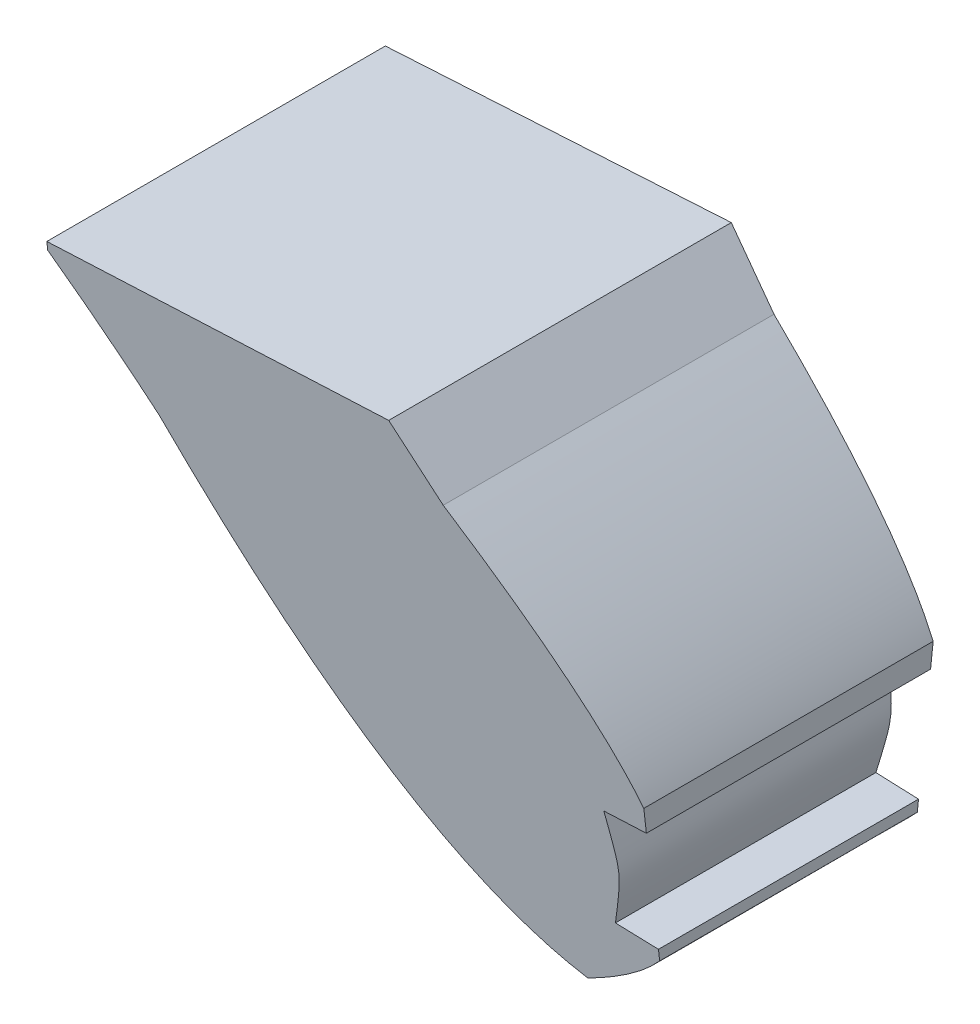
ISO-10303-21;
HEADER;
FILE_DESCRIPTION(('STEP AP214'),'2;1');
FILE_NAME('part.step','',(''),(''),'','','');
FILE_SCHEMA(('AUTOMOTIVE_DESIGN { 1 0 10303 214 1 1 1 1 }'));
ENDSEC;
DATA;
#1=APPLICATION_CONTEXT('core data for automotive mechanical design processes');
#2=APPLICATION_PROTOCOL_DEFINITION('international standard','automotive_design',2000,#1);
#3=PRODUCT_CONTEXT('',#1,'mechanical');
#4=PRODUCT('Part','Part','',(#3));
#5=PRODUCT_RELATED_PRODUCT_CATEGORY('part','',(#4));
#6=PRODUCT_DEFINITION_FORMATION('','',#4);
#7=PRODUCT_DEFINITION_CONTEXT('part definition',#1,'design');
#8=PRODUCT_DEFINITION('design','',#6,#7);
#9=PRODUCT_DEFINITION_SHAPE('','',#8);
#10=(LENGTH_UNIT() NAMED_UNIT(*) SI_UNIT(.MILLI.,.METRE.));
#11=(NAMED_UNIT(*) PLANE_ANGLE_UNIT() SI_UNIT($,.RADIAN.));
#12=(NAMED_UNIT(*) SI_UNIT($,.STERADIAN.) SOLID_ANGLE_UNIT());
#13=UNCERTAINTY_MEASURE_WITH_UNIT(LENGTH_MEASURE(1.E-05),#10,'distance_accuracy_value','');
#14=(GEOMETRIC_REPRESENTATION_CONTEXT(3) GLOBAL_UNCERTAINTY_ASSIGNED_CONTEXT((#13)) GLOBAL_UNIT_ASSIGNED_CONTEXT((#10,
#11,#12)) REPRESENTATION_CONTEXT('',''));
#15=CARTESIAN_POINT('',(0.,0.,0.));
#16=DIRECTION('',(0.,0.,1.));
#17=DIRECTION('',(1.,0.,0.));
#18=AXIS2_PLACEMENT_3D('',#15,#16,#17);
#19=CARTESIAN_POINT('',(0.355125000055651,-1.23774703808888E-13,7.));
#20=DIRECTION('',(-1.,3.48538412642003E-13,0.));
#21=DIRECTION('',(-3.48538412642003E-13,-1.,0.));
#22=AXIS2_PLACEMENT_3D('',#19,#20,#21);
#23=PLANE('',#22);
#24=DIRECTION('',(0.,-0.993653373689782,0.112485434412263));
#25=VECTOR('',#24,1.);
#26=CARTESIAN_POINT('',(0.355125000056697,12.6081551722012,-7.));
#27=LINE('',#26,#25);
#28=CARTESIAN_POINT('',(0.355125000056697,3.0015495286345,-5.91249480185305));
#29=VERTEX_POINT('',#28);
#30=CARTESIAN_POINT('',(0.355125000056447,2.06798317893031,-5.8068114527298));
#31=VERTEX_POINT('',#30);
#32=EDGE_CURVE('E58',#29,#31,#27,.T.);
#33=ORIENTED_EDGE('',*,*,#32,.F.);
#34=DIRECTION('',(0.,0.,-1.));
#35=VECTOR('',#34,1.);
#36=CARTESIAN_POINT('',(0.355125000056697,3.0015495286345,7.));
#37=LINE('',#36,#35);
#38=CARTESIAN_POINT('',(0.355125000056697,3.0015495286345,5.91249480185305));
#39=VERTEX_POINT('',#38);
#40=EDGE_CURVE('E178',#39,#29,#37,.T.);
#41=ORIENTED_EDGE('',*,*,#40,.F.);
#42=DIRECTION('',(0.,0.993653373689782,0.112485434412263));
#43=VECTOR('',#42,1.);
#44=CARTESIAN_POINT('',(0.355125000056697,12.6081551722012,7.));
#45=LINE('',#44,#43);
#46=CARTESIAN_POINT('',(0.355125000056697,2.06798317893032,5.80681145272981));
#47=VERTEX_POINT('',#46);
#48=EDGE_CURVE('E153',#47,#39,#45,.T.);
#49=ORIENTED_EDGE('',*,*,#48,.F.);
#50=DIRECTION('',(0.,0.,-1.));
#51=VECTOR('',#50,1.);
#52=CARTESIAN_POINT('',(0.355125000056447,2.06798317893031,7.));
#53=LINE('',#52,#51);
#54=EDGE_CURVE('E171',#47,#31,#53,.T.);
#55=ORIENTED_EDGE('',*,*,#54,.T.);
#56=EDGE_LOOP('',(#33,#41,#49,#55));
#57=FACE_BOUND('',#56,.T.);
#58=ADVANCED_FACE('F43',(#57),#23,.F.);
#59=CARTESIAN_POINT('',(-23.0359211456035,0.,7.));
#60=DIRECTION('',(-1.,0.,0.));
#61=DIRECTION('',(0.,0.,1.));
#62=AXIS2_PLACEMENT_3D('',#59,#60,#61);
#63=PLANE('',#62);
#64=DIRECTION('',(0.,0.,-1.));
#65=VECTOR('',#64,1.);
#66=CARTESIAN_POINT('',(-23.0359211456035,11.8716122879342,7.));
#67=LINE('',#66,#65);
#68=CARTESIAN_POINT('',(-23.0359211456035,11.8716122879342,6.91662047501294));
#69=VERTEX_POINT('',#68);
#70=CARTESIAN_POINT('',(-23.0359211456035,11.8716122879342,-6.91662047501294));
#71=VERTEX_POINT('',#70);
#72=EDGE_CURVE('E189',#69,#71,#67,.T.);
#73=ORIENTED_EDGE('',*,*,#72,.T.);
#74=DIRECTION('',(0.,-0.993653373689782,0.112485434412263));
#75=VECTOR('',#74,1.);
#76=CARTESIAN_POINT('',(-23.0359211456035,12.6081551722012,-7.));
#77=LINE('',#76,#75);
#78=CARTESIAN_POINT('',(-23.0359211456035,11.5401378200983,-6.87909627341673));
#79=VERTEX_POINT('',#78);
#80=EDGE_CURVE('E321',#71,#79,#77,.T.);
#81=ORIENTED_EDGE('',*,*,#80,.T.);
#82=DIRECTION('',(0.,0.,-1.));
#83=VECTOR('',#82,1.);
#84=CARTESIAN_POINT('',(-23.0359211456035,11.5401378200983,7.));
#85=LINE('',#84,#83);
#86=CARTESIAN_POINT('',(-23.0359211456035,11.5401378200983,6.87909627341673));
#87=VERTEX_POINT('',#86);
#88=EDGE_CURVE('E192',#87,#79,#85,.T.);
#89=ORIENTED_EDGE('',*,*,#88,.F.);
#90=DIRECTION('',(0.,0.993653373689782,0.112485434412263));
#91=VECTOR('',#90,1.);
#92=CARTESIAN_POINT('',(-23.0359211456035,12.6081551722012,7.));
#93=LINE('',#92,#91);
#94=EDGE_CURVE('E317',#87,#69,#93,.T.);
#95=ORIENTED_EDGE('',*,*,#94,.T.);
#96=EDGE_LOOP('',(#73,#81,#89,#95));
#97=FACE_BOUND('',#96,.T.);
#98=ADVANCED_FACE('F318',(#97),#63,.T.);
#99=CARTESIAN_POINT('',(-18.9451921135982,7.54091889574655,7.));
#100=CARTESIAN_POINT('',(-10.2150083842792,-3.69764410322756,7.));
#101=CARTESIAN_POINT('',(-2.84660482498738,-5.05908110388432,7.));
#102=(BOUNDED_CURVE() B_SPLINE_CURVE(2,(#99,#100,#101),.UNSPECIFIED.,.F.,
.F.) B_SPLINE_CURVE_WITH_KNOTS((3,3),(0.497667241108509,0.499554279588011),
.UNSPECIFIED.) CURVE() GEOMETRIC_REPRESENTATION_ITEM() RATIONAL_B_SPLINE_CURVE((1.,1.,1.)) REPRESENTATION_ITEM(''));
#103=DIRECTION('',(0.,0.,-1.));
#104=VECTOR('',#103,1.);
#105=SURFACE_OF_LINEAR_EXTRUSION('',#102,#104);
#106=DIRECTION('',(0.,0.,-1.));
#107=VECTOR('',#106,1.);
#108=CARTESIAN_POINT('',(-18.9451921135982,7.54091889574657,7.));
#109=LINE('',#108,#107);
#110=CARTESIAN_POINT('',(-18.9451921135982,7.54091889574657,6.42636910524442));
#111=VERTEX_POINT('',#110);
#112=CARTESIAN_POINT('',(-18.9451921135982,7.54091889574657,-6.42636910524441));
#113=VERTEX_POINT('',#112);
#114=EDGE_CURVE('E198',#111,#113,#109,.T.);
#115=ORIENTED_EDGE('',*,*,#114,.T.);
#116=CARTESIAN_POINT('',(-18.9451921135982,7.54091889574655,-6.42636910524441));
#117=CARTESIAN_POINT('',(-18.7033608655423,7.22962108931645,-6.39112898035273));
#118=CARTESIAN_POINT('',(-18.4592647140916,6.9200497206851,-6.35608429494821));
#119=CARTESIAN_POINT('',(-17.9661198805234,6.30464603742845,-6.28641819962467));
#120=CARTESIAN_POINT('',(-17.7170694462669,5.99881510969872,-6.25179694670763));
#121=CARTESIAN_POINT('',(-17.2137366178937,5.3913665824337,-6.18303140604553));
#122=CARTESIAN_POINT('',(-16.9594535947769,5.08974949683998,-6.14888717648066));
#123=CARTESIAN_POINT('',(-16.4451285665965,4.49103725761873,-6.08111061767257));
#124=CARTESIAN_POINT('',(-16.1850826962375,4.19394537928884,-6.04747865920581));
#125=CARTESIAN_POINT('',(-15.6590118901181,3.60508061675355,-5.9808168731366));
#126=CARTESIAN_POINT('',(-15.3929875534481,3.31330720485499,-5.94778698579723));
#127=CARTESIAN_POINT('',(-14.8544901847056,2.7357195544677,-5.88240181277285));
#128=CARTESIAN_POINT('',(-14.5820174931064,2.44990500284308,-5.85004649163963));
#129=CARTESIAN_POINT('',(-13.9777704357619,1.83142011947111,-5.78003159245484));
#130=CARTESIAN_POINT('',(-13.6445482479649,1.50014167377654,-5.74252958132897));
#131=CARTESIAN_POINT('',(-12.9673134934436,0.848664446736887,-5.66877982026175));
#132=CARTESIAN_POINT('',(-12.623301443116,0.528465136688492,-5.63253201046914));
#133=CARTESIAN_POINT('',(-11.9227759490938,-0.0995013958587513,-5.5614437516454));
#134=CARTESIAN_POINT('',(-11.5662405708663,-0.407244542107335,-5.52660602813964));
#135=CARTESIAN_POINT('',(-10.840142749037,-1.00720368374379,-5.45868831511867));
#136=CARTESIAN_POINT('',(-10.4705807273197,-1.29942018121482,-5.4256082687657));
#137=CARTESIAN_POINT('',(-9.71382699072171,-1.86779135556405,-5.36126643674768));
#138=CARTESIAN_POINT('',(-9.32650636654571,-2.14377746328672,-5.330023733768));
#139=CARTESIAN_POINT('',(-8.5360986768139,-2.67282289543975,-5.27013372902864));
#140=CARTESIAN_POINT('',(-8.13300835344273,-2.92587744631612,-5.24148696765387));
#141=CARTESIAN_POINT('',(-7.31201826568453,-3.40280761684766,-5.18749661363601));
#142=CARTESIAN_POINT('',(-6.89419365451789,-3.62680992502778,-5.16213867935817));
#143=CARTESIAN_POINT('',(-6.04187322097519,-4.0405536088069,-5.11530128189388));
#144=CARTESIAN_POINT('',(-5.60738935372736,-4.23031901573022,-5.09381909826786));
#145=CARTESIAN_POINT('',(-4.78985442909107,-4.54236533838515,-5.05849423842238));
#146=CARTESIAN_POINT('',(-4.4091055725695,-4.67052923075731,-5.04398558631979));
#147=CARTESIAN_POINT('',(-3.82960691198316,-4.83674345690554,-5.02516948814227));
#148=CARTESIAN_POINT('',(-3.63462104960687,-4.8878904691115,-5.01937944702812));
#149=CARTESIAN_POINT('',(-3.24229120544362,-4.9807402777546,-5.00886848683127));
#150=CARTESIAN_POINT('',(-3.0449461414238,-5.02243854990591,-5.00414807991536));
#151=CARTESIAN_POINT('',(-2.84660482498738,-5.05908110388432,-5.));
#152=B_SPLINE_CURVE_WITH_KNOTS('',3,(#116,#117,#118,#119,#120,#121,#122,#123,#124,#125,#126,
#127,#128,#129,#130,#131,#132,#133,#134,#135,#136,#137,#138,#139,#140,#141,#142,#143,#144,#145,
#146,#147,#148,#149,#150,#151),.UNSPECIFIED.,.F.,.F.,(4,2,2,2,2,2,2,2,2,2,2,2,2,2,2,2,2,4),(0.,
1.1872997216569,2.37502708567824,3.56289806807204,4.75159146291787,5.94016626761519,
7.12867845491362,8.54255640265696,9.95636678593971,11.3727907462706,12.7891688759803,
14.2183172044781,15.6477623519031,17.0707480146133,18.4927309460623,19.6971402338765,
20.3019233237111,20.9069953892921),.UNSPECIFIED.);
#153=CARTESIAN_POINT('',(-2.84660482498738,-5.05908110388432,-5.));
#154=VERTEX_POINT('',#153);
#155=EDGE_CURVE('E258',#113,#154,#152,.T.);
#156=ORIENTED_EDGE('',*,*,#155,.T.);
#157=DIRECTION('',(0.,0.,-1.));
#158=VECTOR('',#157,1.);
#159=CARTESIAN_POINT('',(-2.84660482498738,-5.05908110388432,7.));
#160=LINE('',#159,#158);
#161=CARTESIAN_POINT('',(-2.84660482498738,-5.05908110388432,5.));
#162=VERTEX_POINT('',#161);
#163=EDGE_CURVE('E158',#162,#154,#160,.T.);
#164=ORIENTED_EDGE('',*,*,#163,.F.);
#165=CARTESIAN_POINT('',(-2.84660482498738,-5.05908110388432,5.));
#166=CARTESIAN_POINT('',(-3.0836355452615,-5.01529762547054,5.00495646039138));
#167=CARTESIAN_POINT('',(-3.31925014057108,-4.96428184629726,5.01073164541478));
#168=CARTESIAN_POINT('',(-3.78628189704186,-4.84911384389608,5.02376911212451));
#169=CARTESIAN_POINT('',(-4.01771143135529,-4.78501130060695,5.03102576984815));
#170=CARTESIAN_POINT('',(-4.47638324853452,-4.64477679089168,5.04690086287615));
#171=CARTESIAN_POINT('',(-4.70363211310207,-4.56866593727755,5.05551690812791));
#172=CARTESIAN_POINT('',(-5.15398016115681,-4.40545252874729,5.07399330205617));
#173=CARTESIAN_POINT('',(-5.37708095327682,-4.31835434125152,5.08385315632366));
#174=CARTESIAN_POINT('',(-5.81545834234536,-4.13567110279715,5.10453361087802));
#175=CARTESIAN_POINT('',(-6.03080317783365,-4.04024711994086,5.11533597762798));
#176=CARTESIAN_POINT('',(-6.45748946905634,-3.84057736608456,5.13793937192646));
#177=CARTESIAN_POINT('',(-6.66882789943329,-3.73632522989765,5.14974112003892));
#178=CARTESIAN_POINT('',(-7.08747417766979,-3.51983158147829,5.17424904476877));
#179=CARTESIAN_POINT('',(-7.29477947597257,-3.40758521204135,5.18695577124062));
#180=CARTESIAN_POINT('',(-7.70530843131035,-3.17590609220346,5.21318275051655));
#181=CARTESIAN_POINT('',(-7.90853147430462,-3.0564722713248,5.22670312450288));
#182=CARTESIAN_POINT('',(-8.45410340689061,-2.72385368196738,5.26435684511426));
#183=CARTESIAN_POINT('',(-8.79259906035209,-2.50440768840731,5.28919898682003));
#184=CARTESIAN_POINT('',(-9.45845448583479,-2.04949644973372,5.3406967119384));
#185=CARTESIAN_POINT('',(-9.78581359629267,-1.81403025542841,5.3673524028032));
#186=CARTESIAN_POINT('',(-10.4302582396863,-1.32938575303013,5.42221604925302));
#187=CARTESIAN_POINT('',(-10.7473396395034,-1.08020203459831,5.45042461730948));
#188=CARTESIAN_POINT('',(-11.3718438106499,-0.570176876647104,5.50816145288252));
#189=CARTESIAN_POINT('',(-11.6792662750814,-0.309335067346119,5.53768976225981));
#190=CARTESIAN_POINT('',(-12.2887351366992,0.225514030316342,5.59823676455314));
#191=CARTESIAN_POINT('',(-12.5906756597182,0.499640146613562,5.62926890925461));
#192=CARTESIAN_POINT('',(-13.1859914625247,1.05668157973797,5.69232817041119));
#193=CARTESIAN_POINT('',(-13.4793699933214,1.33959347409339,5.72435489942917));
#194=CARTESIAN_POINT('',(-14.0582984741035,1.91313890151101,5.78928247705987));
#195=CARTESIAN_POINT('',(-14.3438493181123,2.20377154523463,5.82218322499598));
#196=CARTESIAN_POINT('',(-14.9077244427009,2.7918210558895,5.88875272137508));
#197=CARTESIAN_POINT('',(-15.1860493084316,3.08923736980037,5.92242140721399));
#198=CARTESIAN_POINT('',(-15.7683607406539,3.72540309630891,5.99443784674841));
#199=CARTESIAN_POINT('',(-16.0715178451228,4.06490144250158,6.03287038264566));
#200=CARTESIAN_POINT('',(-16.6701836985208,4.7504922746204,6.11048193675692));
#201=CARTESIAN_POINT('',(-16.9656923307507,5.09658486102068,6.14966096634501));
#202=CARTESIAN_POINT('',(-17.4495199616275,5.67490501691598,6.21512906184765));
#203=CARTESIAN_POINT('',(-17.6398456690967,5.90547984199544,6.24123103065322));
#204=CARTESIAN_POINT('',(-18.0176052393411,6.36895711711416,6.29369846448112));
#205=CARTESIAN_POINT('',(-18.205039097963,6.60185957049552,6.3200639298818));
#206=CARTESIAN_POINT('',(-18.5771476687389,7.06981539005112,6.37303835239394));
#207=CARTESIAN_POINT('',(-18.7618224957771,7.30486866600559,6.39964729929217));
#208=CARTESIAN_POINT('',(-18.9451921135982,7.54091889574655,6.42636910524441));
#209=B_SPLINE_CURVE_WITH_KNOTS('',3,(#165,#166,#167,#168,#169,#170,#171,#172,#173,#174,#175,
#176,#177,#178,#179,#180,#181,#182,#183,#184,#185,#186,#187,#188,#189,#190,#191,#192,#193,#194,
#195,#196,#197,#198,#199,#200,#201,#202,#203,#204,#205,#206,#207,#208),.UNSPECIFIED.,.F.,.F.,(4,
2,2,2,2,2,2,2,2,2,2,2,2,2,2,2,2,2,2,2,2,4),(0.,0.723070627629283,1.44344574109941,
2.16256813451498,2.88140557514503,3.58855192345824,4.2962125448096,5.0043068623572,
5.71250690363926,6.92441762508089,8.13640021448464,9.3488642962315,10.5613668633146,
11.788141520998,13.0144441434254,14.2406061176645,15.4666684871313,16.8368576095009,
18.2070676256843,19.1073954524656,20.0077245721621,20.9080160976373),.UNSPECIFIED.);
#210=EDGE_CURVE('E139',#162,#111,#209,.T.);
#211=ORIENTED_EDGE('',*,*,#210,.T.);
#212=EDGE_LOOP('',(#115,#156,#164,#211));
#213=FACE_BOUND('',#212,.T.);
#214=ADVANCED_FACE('F44',(#213),#105,.F.);
#215=CARTESIAN_POINT('',(-2.84660482498738,-5.05908110388432,7.));
#216=CARTESIAN_POINT('',(-0.742366881974002,-3.93520659958673,7.));
#217=CARTESIAN_POINT('',(0.355124999965198,-2.72325322699678,7.));
#218=(BOUNDED_CURVE() B_SPLINE_CURVE(2,(#215,#216,#217),.UNSPECIFIED.,.F.,
.F.) B_SPLINE_CURVE_WITH_KNOTS((3,3),(0.498812074629495,0.499412845463797),
.UNSPECIFIED.) CURVE() GEOMETRIC_REPRESENTATION_ITEM() RATIONAL_B_SPLINE_CURVE((1.,1.,1.)) REPRESENTATION_ITEM(''));
#219=DIRECTION('',(0.,0.,-1.));
#220=VECTOR('',#219,1.);
#221=SURFACE_OF_LINEAR_EXTRUSION('',#218,#220);
#222=ORIENTED_EDGE('',*,*,#163,.T.);
#223=CARTESIAN_POINT('',(-2.84660482498738,-5.05908110388432,-5.));
#224=CARTESIAN_POINT('',(-2.67154367534484,-4.96554243060771,-5.01058894235803));
#225=CARTESIAN_POINT('',(-2.49778385523126,-4.86952307483158,-5.02145870764284));
#226=CARTESIAN_POINT('',(-2.15332890723938,-4.67164155861341,-5.04385966647148));
#227=CARTESIAN_POINT('',(-1.9826387176766,-4.56977092703724,-5.05539181898071));
#228=CARTESIAN_POINT('',(-1.64527137465746,-4.35955519460265,-5.0791890591545));
#229=CARTESIAN_POINT('',(-1.47859514121983,-4.25120862887406,-5.09145431264808));
#230=CARTESIAN_POINT('',(-1.15044448784201,-4.02724001195876,-5.11680843294344));
#231=CARTESIAN_POINT('',(-0.98896568487432,-3.911624347545,-5.12989657673763));
#232=CARTESIAN_POINT('',(-0.724614348138144,-3.7114805449727,-5.15255363519824));
#233=CARTESIAN_POINT('',(-0.619967455079453,-3.6292658395869,-5.16186066025876));
#234=CARTESIAN_POINT('',(-0.414118763296717,-3.46070156785231,-5.18094279275538));
#235=CARTESIAN_POINT('',(-0.312916415666604,-3.3743526656372,-5.19071782500895));
#236=CARTESIAN_POINT('',(-0.114288127047668,-3.19685300163986,-5.21081147873311));
#237=CARTESIAN_POINT('',(-0.0168745915935635,-3.10568844995875,-5.221131661274));
#238=CARTESIAN_POINT('',(0.173044677325634,-2.91833195578561,-5.24234114658855));
#239=CARTESIAN_POINT('',(0.265547074526193,-2.82213668167119,-5.25323082651485));
#240=CARTESIAN_POINT('',(0.355124999965198,-2.72325322699678,-5.26442481895704));
#241=B_SPLINE_CURVE_WITH_KNOTS('',3,(#223,#224,#225,#226,#227,#228,#229,#230,#231,#232,#233,
#234,#235,#236,#237,#238,#239,#240),.UNSPECIFIED.,.F.,.F.,(4,2,2,2,2,2,2,2,4),(0.,
0.596333361221147,1.19355295493407,1.79090815604603,2.38774565156578,2.78786762990545,
3.18792554534165,3.58919872466333,3.99074110013676),.UNSPECIFIED.);
#242=CARTESIAN_POINT('',(0.355125000010947,-2.72325322699678,-5.26442481895704));
#243=VERTEX_POINT('',#242);
#244=EDGE_CURVE('E160',#154,#243,#241,.T.);
#245=ORIENTED_EDGE('',*,*,#244,.T.);
#246=DIRECTION('',(0.,0.,-1.));
#247=VECTOR('',#246,1.);
#248=CARTESIAN_POINT('',(0.355124999965198,-2.72325322699678,7.));
#249=LINE('',#248,#247);
#250=CARTESIAN_POINT('',(0.355125000010947,-2.72325322699678,5.26442481895704));
#251=VERTEX_POINT('',#250);
#252=EDGE_CURVE('E149',#251,#243,#249,.T.);
#253=ORIENTED_EDGE('',*,*,#252,.F.);
#254=CARTESIAN_POINT('',(0.355124999965198,-2.72325322699678,5.26442481895704));
#255=CARTESIAN_POINT('',(0.288265800066398,-2.79707578870119,5.25606781726749));
#256=CARTESIAN_POINT('',(0.219762299322532,-2.86939557158838,5.24788093599675));
#257=CARTESIAN_POINT('',(0.0798741499126208,-3.0111837154317,5.23182996553057));
#258=CARTESIAN_POINT('',(0.00849051694650469,-3.08065306448068,5.22396576447915));
#259=CARTESIAN_POINT('',(-0.209110404202349,-3.28478130911614,5.20085765164865));
#260=CARTESIAN_POINT('',(-0.359086186155244,-3.41549544786354,5.18606030171743));
#261=CARTESIAN_POINT('',(-0.666431647279958,-3.66745151891472,5.15753789253991));
#262=CARTESIAN_POINT('',(-0.823790135326829,-3.78870709059741,5.14381128926277));
#263=CARTESIAN_POINT('',(-1.14463764434189,-4.02329424679429,5.11725510893767));
#264=CARTESIAN_POINT('',(-1.30813354467851,-4.13661650521983,5.10442658763929));
#265=CARTESIAN_POINT('',(-1.58497175174893,-4.31986712055689,5.08368190381061));
#266=CARTESIAN_POINT('',(-1.69701528140079,-4.39175032218513,5.07554444523986));
#267=CARTESIAN_POINT('',(-1.92294333828473,-4.53261962763427,5.05959749086083));
#268=CARTESIAN_POINT('',(-2.03682799400811,-4.6016055280346,5.05178801808056));
#269=CARTESIAN_POINT('',(-2.26591352019373,-4.73675126913538,5.03648899349189));
#270=CARTESIAN_POINT('',(-2.38111062922232,-4.80291742324192,5.02899872698133));
#271=CARTESIAN_POINT('',(-2.6128736149529,-4.93278949726635,5.01429670205848));
#272=CARTESIAN_POINT('',(-2.72943923096306,-4.99649587614853,5.00708489168965));
#273=CARTESIAN_POINT('',(-2.84660482498738,-5.05908110388432,5.));
#274=B_SPLINE_CURVE_WITH_KNOTS('',3,(#254,#255,#256,#257,#258,#259,#260,#261,#262,#263,#264,
#265,#266,#267,#268,#269,#270,#271,#272,#273),.UNSPECIFIED.,.F.,.F.,(4,2,2,2,2,2,2,2,2,4),(0.,
0.299782926841572,0.599461041577767,1.1974499434567,1.79455995327913,2.39236050766276,
2.79242459253001,3.19251671924541,3.59166012626068,3.99072869445439),.UNSPECIFIED.);
#275=EDGE_CURVE('E131',#251,#162,#274,.T.);
#276=ORIENTED_EDGE('',*,*,#275,.T.);
#277=EDGE_LOOP('',(#222,#245,#253,#276));
#278=FACE_BOUND('',#277,.T.);
#279=ADVANCED_FACE('F156',(#278),#221,.F.);
#280=CARTESIAN_POINT('',(0.355125000532009,-7.39148800447813E-11,7.));
#281=DIRECTION('',(1.,-2.08137641489758E-10,0.));
#282=DIRECTION('',(2.08137641489758E-10,1.,0.));
#283=AXIS2_PLACEMENT_3D('',#280,#281,#282);
#284=PLANE('',#283);
#285=CARTESIAN_POINT('',(0.355125000056697,-2.28484178142546,-5.31405470319249));
#286=VERTEX_POINT('',#285);
#287=EDGE_CURVE('E155',#286,#243,#27,.T.);
#288=ORIENTED_EDGE('',*,*,#287,.F.);
#289=DIRECTION('',(0.,0.,-1.));
#290=VECTOR('',#289,1.);
#291=CARTESIAN_POINT('',(0.355125000056447,-2.28484178142545,7.));
#292=LINE('',#291,#290);
#293=CARTESIAN_POINT('',(0.355125000056697,-2.28484178142546,5.31405470319249));
#294=VERTEX_POINT('',#293);
#295=EDGE_CURVE('E151',#294,#286,#292,.T.);
#296=ORIENTED_EDGE('',*,*,#295,.F.);
#297=EDGE_CURVE('E133',#251,#294,#45,.T.);
#298=ORIENTED_EDGE('',*,*,#297,.F.);
#299=ORIENTED_EDGE('',*,*,#252,.T.);
#300=EDGE_LOOP('',(#288,#296,#298,#299));
#301=FACE_BOUND('',#300,.T.);
#302=ADVANCED_FACE('F146',(#301),#284,.T.);
#303=CARTESIAN_POINT('',(-0.0792587195419091,-2.26967276768239,7.));
#304=DIRECTION('',(-0.0348994967024901,-0.999390827019096,0.));
#305=DIRECTION('',(0.999390827019096,-0.0348994967024901,0.));
#306=AXIS2_PLACEMENT_3D('',#303,#304,#305);
#307=PLANE('',#306);
#308=ORIENTED_EDGE('',*,*,#295,.T.);
#309=DIRECTION('',(-0.999383027616045,0.034899224341334,-0.00395072820626436));
#310=VECTOR('',#309,1.);
#311=CARTESIAN_POINT('',(-0.0306324717090319,-2.27137083367421,-5.31557966697752));
#312=LINE('',#311,#310);
#313=CARTESIAN_POINT('',(-1.39487499994356,-2.22373043481491,-5.32097274579469));
#314=VERTEX_POINT('',#313);
#315=EDGE_CURVE('E304',#286,#314,#312,.T.);
#316=ORIENTED_EDGE('',*,*,#315,.T.);
#317=DIRECTION('',(0.,0.,-1.));
#318=VECTOR('',#317,1.);
#319=CARTESIAN_POINT('',(-1.39487499994356,-2.22373043481491,7.));
#320=LINE('',#319,#318);
#321=CARTESIAN_POINT('',(-1.39487499994356,-2.22373043481491,5.3209727457947));
#322=VERTEX_POINT('',#321);
#323=EDGE_CURVE('E161',#322,#314,#320,.T.);
#324=ORIENTED_EDGE('',*,*,#323,.F.);
#325=DIRECTION('',(0.999383027616045,-0.034899224341334,-0.00395072820626436));
#326=VECTOR('',#325,1.);
#327=CARTESIAN_POINT('',(-0.0859085417339361,-2.26944055077446,5.31579818252456));
#328=LINE('',#327,#326);
#329=EDGE_CURVE('E322',#322,#294,#328,.T.);
#330=ORIENTED_EDGE('',*,*,#329,.T.);
#331=EDGE_LOOP('',(#308,#316,#324,#330));
#332=FACE_BOUND('',#331,.T.);
#333=ADVANCED_FACE('F333',(#332),#307,.F.);
#334=CARTESIAN_POINT('',(-1.39487499994356,-2.22373043481491,7.));
#335=CARTESIAN_POINT('',(-0.907530669798052,-0.123730434814926,7.));
#336=CARTESIAN_POINT('',(-1.39487499994356,1.976269565185,7.));
#337=(BOUNDED_CURVE() B_SPLINE_CURVE(2,(#334,#335,#336),.UNSPECIFIED.,.F.,
.F.) B_SPLINE_CURVE_WITH_KNOTS((3,3),(0.,1.),
.UNSPECIFIED.) CURVE() GEOMETRIC_REPRESENTATION_ITEM() RATIONAL_B_SPLINE_CURVE((1.,
3.23180121851367,1.)) REPRESENTATION_ITEM(''));
#338=DIRECTION('',(0.,0.,-1.));
#339=VECTOR('',#338,1.);
#340=SURFACE_OF_LINEAR_EXTRUSION('',#337,#339);
#341=ORIENTED_EDGE('',*,*,#323,.T.);
#342=CARTESIAN_POINT('',(-1.39487499994356,-2.22373043481491,-5.32097274579469));
#343=CARTESIAN_POINT('',(-1.38202447122813,-2.16835021356968,-5.32724200266994));
#344=CARTESIAN_POINT('',(-1.36921744547373,-2.11295996104296,-5.33351239512535));
#345=CARTESIAN_POINT('',(-1.34371955909939,-2.00215267308472,-5.34605621196536));
#346=CARTESIAN_POINT('',(-1.33102869927897,-1.94673563747162,-5.35232963637053));
#347=CARTESIAN_POINT('',(-1.30579250980865,-1.83586894873068,-5.36488017761064));
#348=CARTESIAN_POINT('',(-1.29324717983284,-1.78041929567618,-5.37115729443729));
#349=CARTESIAN_POINT('',(-1.26834035470031,-1.66945670178657,-5.383718692514));
#350=CARTESIAN_POINT('',(-1.25597893242913,-1.61394374477822,-5.39000297559494));
#351=CARTESIAN_POINT('',(-1.23150428056634,-1.50286329328951,-5.40257771561119));
#352=CARTESIAN_POINT('',(-1.21939105277074,-1.44729579841754,-5.40886817259083));
#353=CARTESIAN_POINT('',(-1.19550012207595,-1.33608743052918,-5.42145739324204));
#354=CARTESIAN_POINT('',(-1.1837224309966,-1.2804465549999,-5.42775615719808));
#355=CARTESIAN_POINT('',(-1.15485704104805,-1.14125615214793,-5.44351305326002));
#356=CARTESIAN_POINT('',(-1.13805530724695,-1.05764770999797,-5.45297785475397));
#357=CARTESIAN_POINT('',(-1.10616760722362,-0.890046794372653,-5.47195093158457));
#358=CARTESIAN_POINT('',(-1.09108267359643,-0.806054121054038,-5.48145922954426));
#359=CARTESIAN_POINT('',(-1.06839764881353,-0.664871544058104,-5.49744164748328));
#360=CARTESIAN_POINT('',(-1.05995626751594,-0.607817685780514,-5.50390036659317));
#361=CARTESIAN_POINT('',(-1.04516806244473,-0.493450404650503,-5.51684718853439));
#362=CARTESIAN_POINT('',(-1.03882061818002,-0.436137063802354,-5.52333528208253));
#363=CARTESIAN_POINT('',(-1.02903068414648,-0.321308074689071,-5.53633437116685));
#364=CARTESIAN_POINT('',(-1.02558541499307,-0.263792673078833,-5.54284533878074));
#365=CARTESIAN_POINT('',(-1.02222407231355,-0.148714957691158,-5.55587258464867));
#366=CARTESIAN_POINT('',(-1.02230420900467,-0.0911527608046732,-5.56238884967019));
#367=CARTESIAN_POINT('',(-1.02596900528622,0.0239015023985966,-5.57541344065945));
#368=CARTESIAN_POINT('',(-1.02955657044098,0.0813934710005595,-5.58192175556548));
#369=CARTESIAN_POINT('',(-1.03959132289802,0.196133385303809,-5.59491076103416));
#370=CARTESIAN_POINT('',(-1.04603929917214,0.253381259276288,-5.60139144347683));
#371=CARTESIAN_POINT('',(-1.05997220439613,0.35983137212623,-5.6134420111136));
#372=CARTESIAN_POINT('',(-1.06719667195452,0.409068491171902,-5.61901584487869));
#373=CARTESIAN_POINT('',(-1.08274764683563,0.507347946837772,-5.63014146227917));
#374=CARTESIAN_POINT('',(-1.0910737056158,0.556390354412903,-5.63569325394695));
#375=CARTESIAN_POINT('',(-1.10853037258208,0.654424381213792,-5.64679108784343));
#376=CARTESIAN_POINT('',(-1.11766242226862,0.703415744133191,-5.65233710105724));
#377=CARTESIAN_POINT('',(-1.1364977866421,0.801294033672847,-5.6634173048888));
#378=CARTESIAN_POINT('',(-1.14620115522269,0.850180949988233,-5.66895149433999));
#379=CARTESIAN_POINT('',(-1.16833495400599,0.959258362431623,-5.68129948252998));
#380=CARTESIAN_POINT('',(-1.1808737668477,1.01942705832357,-5.68811081339709));
#381=CARTESIAN_POINT('',(-1.20639174214038,1.13967062360228,-5.70172285360526));
#382=CARTESIAN_POINT('',(-1.21937089694786,1.19974549459873,-5.70852356312855));
#383=CARTESIAN_POINT('',(-1.24564626429316,1.31982703510014,-5.72211726150049));
#384=CARTESIAN_POINT('',(-1.2589424791072,1.37983370411223,-5.72891025029334));
#385=CARTESIAN_POINT('',(-1.28569888355067,1.49948275843749,-5.74245498954463));
#386=CARTESIAN_POINT('',(-1.29915785770072,1.55912541262012,-5.74920677044014));
#387=CARTESIAN_POINT('',(-1.32625009614692,1.67837055204035,-5.76270578495002));
#388=CARTESIAN_POINT('',(-1.33988335761136,1.73797303791406,-5.76945301863641));
#389=CARTESIAN_POINT('',(-1.36728618039678,1.85714403003134,-5.78294363938264));
#390=CARTESIAN_POINT('',(-1.381055735056,1.91671253778666,-5.7896870266136));
#391=CARTESIAN_POINT('',(-1.39487499994356,1.976269565185,-5.79642911422342));
#392=B_SPLINE_CURVE_WITH_KNOTS('',3,(#342,#343,#344,#345,#346,#347,#348,#349,#350,#351,#352,
#353,#354,#355,#356,#357,#358,#359,#360,#361,#362,#363,#364,#365,#366,#367,#368,#369,#370,#371,
#372,#373,#374,#375,#376,#377,#378,#379,#380,#381,#382,#383,#384,#385,#386,#387,#388,#389,#390,
#391),.UNSPECIFIED.,.F.,.F.,(4,2,2,2,2,2,2,2,2,2,2,2,2,2,2,2,2,2,2,2,2,2,2,2,4),(0.,
0.171588763273453,0.343178706622211,0.514768265617104,0.686424107910212,0.858081191922478,
1.02974431538338,1.28714724145325,1.54470417716685,1.71878537631805,1.8928149439917,
2.06667765516018,2.24035346989174,2.41417328020677,2.58804106414591,2.73825198714263,
2.88840193486919,3.03882608638502,3.18926445051695,3.37477476712053,3.56028186526787,
3.74579029559563,3.93033206952695,4.11487084894101,4.29940065253389),.UNSPECIFIED.);
#393=CARTESIAN_POINT('',(-1.39487499994356,1.976269565185,-5.79642911422342));
#394=VERTEX_POINT('',#393);
#395=EDGE_CURVE('E179',#314,#394,#392,.T.);
#396=ORIENTED_EDGE('',*,*,#395,.T.);
#397=DIRECTION('',(0.,0.,-1.));
#398=VECTOR('',#397,1.);
#399=CARTESIAN_POINT('',(-1.39487499994356,1.976269565185,7.));
#400=LINE('',#399,#398);
#401=CARTESIAN_POINT('',(-1.39487499994356,1.976269565185,5.79642911422342));
#402=VERTEX_POINT('',#401);
#403=EDGE_CURVE('E166',#402,#394,#400,.T.);
#404=ORIENTED_EDGE('',*,*,#403,.F.);
#405=CARTESIAN_POINT('',(-1.39487499994356,1.976269565185,5.79642911422342));
#406=CARTESIAN_POINT('',(-1.37907511533365,1.90817072448153,5.78872006005792));
#407=CARTESIAN_POINT('',(-1.36333836969219,1.84005724657732,5.78100934890426));
#408=CARTESIAN_POINT('',(-1.33204781411177,1.703774616767,5.76558162408294));
#409=CARTESIAN_POINT('',(-1.31649404111311,1.63560545649229,5.75786460946793));
#410=CARTESIAN_POINT('',(-1.28563112684324,1.49920642241426,5.74242370722985));
#411=CARTESIAN_POINT('',(-1.27032200601989,1.43097654403409,5.73469981908867));
#412=CARTESIAN_POINT('',(-1.2399275173513,1.29390485970128,5.71918277022027));
#413=CARTESIAN_POINT('',(-1.22484485449072,1.22506245970345,5.71138954224482));
#414=CARTESIAN_POINT('',(-1.19518112320204,1.0872751663326,5.69579148364441));
#415=CARTESIAN_POINT('',(-1.18060002365467,1.01833027959621,5.68798665377074));
#416=CARTESIAN_POINT('',(-1.1521828568661,0.880291295746957,5.67236010282727));
#417=CARTESIAN_POINT('',(-1.13834675067045,0.81119720663251,5.66453838266293));
#418=CARTESIAN_POINT('',(-1.11516473949854,0.690174385789182,5.65083812768789));
#419=CARTESIAN_POINT('',(-1.10556404533104,0.638294159941606,5.64496508393199));
#420=CARTESIAN_POINT('',(-1.08728934318226,0.534373551286744,5.6332008660282));
#421=CARTESIAN_POINT('',(-1.07861528667302,0.482333177013413,5.62730969284637));
#422=CARTESIAN_POINT('',(-1.06260440200736,0.378149691610768,5.61551571627023));
#423=CARTESIAN_POINT('',(-1.05526500549272,0.326006977236309,5.60961295779011));
#424=CARTESIAN_POINT('',(-1.04244257361275,0.221494061638693,5.59778168843203));
#425=CARTESIAN_POINT('',(-1.03695934618146,0.169123884520429,5.59185318028283));
#426=CARTESIAN_POINT('',(-1.02917052981484,0.0729301509045448,5.58096367474698));
#427=CARTESIAN_POINT('',(-1.02648754730517,0.0291375389214666,5.57600618039996));
#428=CARTESIAN_POINT('',(-1.02311803398459,-0.0585228047861236,5.56608268785843));
#429=CARTESIAN_POINT('',(-1.02243133042271,-0.10239052968188,5.56111669043696));
#430=CARTESIAN_POINT('',(-1.02313587995194,-0.190112899664059,5.55118617627941));
#431=CARTESIAN_POINT('',(-1.02452732528276,-0.233967543165022,5.54622165972282));
#432=CARTESIAN_POINT('',(-1.02922830316647,-0.321575626235211,5.53630408328911));
#433=CARTESIAN_POINT('',(-1.03253802615093,-0.365329055323649,5.53135102459847));
#434=CARTESIAN_POINT('',(-1.04481913269156,-0.496026010219698,5.51655561994619));
#435=CARTESIAN_POINT('',(-1.05614963950478,-0.582745183351363,5.50673867158183));
#436=CARTESIAN_POINT('',(-1.08246686740171,-0.755641929816293,5.48716608606103));
#437=CARTESIAN_POINT('',(-1.09745579058543,-0.84181914476287,5.47741048947536));
#438=CARTESIAN_POINT('',(-1.129420439335,-1.01366509487317,5.45795685819712));
#439=CARTESIAN_POINT('',(-1.14639302616418,-1.09933441387988,5.44825875741124));
#440=CARTESIAN_POINT('',(-1.18149622255001,-1.27039766561497,5.42889373063944));
#441=CARTESIAN_POINT('',(-1.19962634896168,-1.35579169781193,5.41922679339328));
#442=CARTESIAN_POINT('',(-1.24641099322308,-1.57177275123237,5.39477689641502));
#443=CARTESIAN_POINT('',(-1.2755379218154,-1.70225834502177,5.38000541866374));
#444=CARTESIAN_POINT('',(-1.31987060164556,-1.89787014932725,5.35786140006925));
#445=CARTESIAN_POINT('',(-1.33475842772637,-1.96306843680887,5.35048069983263));
#446=CARTESIAN_POINT('',(-1.36470186719661,-2.09342597092531,5.33572371893541));
#447=CARTESIAN_POINT('',(-1.37975747811874,-2.15858521811941,5.32834743821149));
#448=CARTESIAN_POINT('',(-1.39487499994356,-2.22373043481491,5.3209727457947));
#449=B_SPLINE_CURVE_WITH_KNOTS('',3,(#405,#406,#407,#408,#409,#410,#411,#412,#413,#414,#415,
#416,#417,#418,#419,#420,#421,#422,#423,#424,#425,#426,#427,#428,#429,#430,#431,#432,#433,#434,
#435,#436,#437,#438,#439,#440,#441,#442,#443,#444,#445,#446,#447,#448),.UNSPECIFIED.,.F.,.F.,(4,
2,2,2,2,2,2,2,2,2,2,2,2,2,2,2,2,2,2,2,2,4),(0.,0.210994688118994,0.422031267037357,
0.633085392962154,0.845798629208893,1.05849864386888,1.27118752598179,1.4304428147189,
1.58968975917224,1.7486269361582,1.90754766218714,2.03996993828288,2.1723807546786,
2.30480382052941,2.43724003455642,2.70109168787962,2.96510255404672,3.22870119353187,
3.49219051999256,3.89571487778355,4.09756249770236,4.29940715332609),.UNSPECIFIED.);
#450=EDGE_CURVE('E67',#402,#322,#449,.T.);
#451=ORIENTED_EDGE('',*,*,#450,.T.);
#452=EDGE_LOOP('',(#341,#396,#404,#451));
#453=FACE_BOUND('',#452,.T.);
#454=ADVANCED_FACE('F176',(#453),#340,.F.);
#455=CARTESIAN_POINT('',(0.355125000056697,3.0015495286345,7.));
#456=CARTESIAN_POINT('',(-1.44872627004384,6.0584273141466,7.));
#457=CARTESIAN_POINT('',(-6.99487502582887,10.4773899922143,7.));
#458=(BOUNDED_CURVE() B_SPLINE_CURVE(2,(#455,#456,#457),.UNSPECIFIED.,.F.,
.F.) B_SPLINE_CURVE_WITH_KNOTS((3,3),(0.500820705122982,0.502013311782223),
.UNSPECIFIED.) CURVE() GEOMETRIC_REPRESENTATION_ITEM() RATIONAL_B_SPLINE_CURVE((1.,1.,1.)) REPRESENTATION_ITEM(''));
#459=DIRECTION('',(0.,0.,-1.));
#460=VECTOR('',#459,1.);
#461=SURFACE_OF_LINEAR_EXTRUSION('',#458,#460);
#462=ORIENTED_EDGE('',*,*,#40,.T.);
#463=CARTESIAN_POINT('',(0.355125000056697,3.0015495286345,-5.91249480185305));
#464=CARTESIAN_POINT('',(0.304611825062614,3.08713910892722,-5.92218387590574));
#465=CARTESIAN_POINT('',(0.252829574975965,3.17197675667728,-5.93178782826414));
#466=CARTESIAN_POINT('',(0.146996425684332,3.34022678950728,-5.95083438769209));
#467=CARTESIAN_POINT('',(0.092945870986308,3.42363938833331,-5.96027701895852));
#468=CARTESIAN_POINT('',(-0.0720259816016992,3.67159280703978,-5.9883463122913));
#469=CARTESIAN_POINT('',(-0.185954424573863,3.83416207979728,-6.00674978753972));
#470=CARTESIAN_POINT('',(-0.420195702371685,4.15456473361426,-6.04302061663943));
#471=CARTESIAN_POINT('',(-0.540506139916056,4.3123998585806,-6.06088816790776));
#472=CARTESIAN_POINT('',(-0.785880610008438,4.62328354155297,-6.09608141241009));
#473=CARTESIAN_POINT('',(-0.910922246407595,4.77634960365364,-6.11340908717582));
#474=CARTESIAN_POINT('',(-1.16542402575789,5.0789091469452,-6.14766000662507));
#475=CARTESIAN_POINT('',(-1.29488601263671,5.22840109188721,-6.16458307739923));
#476=CARTESIAN_POINT('',(-1.55752786665308,5.52415387167798,-6.19806344469258));
#477=CARTESIAN_POINT('',(-1.6907082385264,5.67041426299934,-6.21462069100275));
#478=CARTESIAN_POINT('',(-1.95676457683924,5.9562751983388,-6.24698126295326));
#479=CARTESIAN_POINT('',(-2.08955967948613,6.0959502005499,-6.26279301755123));
#480=CARTESIAN_POINT('',(-2.35774738083663,6.37276289931955,-6.29412929385883));
#481=CARTESIAN_POINT('',(-2.49313949667974,6.50990105841303,-6.30965386792921));
#482=CARTESIAN_POINT('',(-2.76622057988734,6.78188630008672,-6.34044365727978));
#483=CARTESIAN_POINT('',(-2.90390945120438,6.91673347799924,-6.35570888335196));
#484=CARTESIAN_POINT('',(-3.18157989443261,7.18458262668443,-6.38603045085686));
#485=CARTESIAN_POINT('',(-3.32156519397778,7.31758077815757,-6.40108635992999));
#486=CARTESIAN_POINT('',(-3.60336702010312,7.58165632334332,-6.4309807408121));
#487=CARTESIAN_POINT('',(-3.74518361420142,7.7127336458542,-6.44581920456076));
#488=CARTESIAN_POINT('',(-4.03045824598403,7.9731143136119,-6.47529531091817));
#489=CARTESIAN_POINT('',(-4.17391630095381,8.10241764014601,-6.48993295140857));
#490=CARTESIAN_POINT('',(-4.46327774044283,8.36024031964194,-6.51911948352564));
#491=CARTESIAN_POINT('',(-4.60919106044248,8.48874865574429,-6.53366712800089));
#492=CARTESIAN_POINT('',(-4.902378301708,8.74421850432193,-6.56258731048845));
#493=CARTESIAN_POINT('',(-5.04965220356223,8.87118003880593,-6.57695985099224));
#494=CARTESIAN_POINT('',(-5.34544402422969,9.12366570876955,-6.60554221283062));
#495=CARTESIAN_POINT('',(-5.4939619526495,9.24918983313146,-6.61975203290664));
#496=CARTESIAN_POINT('',(-5.79168814535511,9.49851914833085,-6.64797708308463));
#497=CARTESIAN_POINT('',(-5.94089298845833,9.62232837448879,-6.66199277000059));
#498=CARTESIAN_POINT('',(-6.24034209654586,9.86869525036086,-6.68988246050136));
#499=CARTESIAN_POINT('',(-6.39058634943962,9.99125291459239,-6.70375646572961));
#500=CARTESIAN_POINT('',(-6.69203115149199,10.2351870903959,-6.7313707651018));
#501=CARTESIAN_POINT('',(-6.84323165475483,10.356563657956,-6.74511106558381));
#502=CARTESIAN_POINT('',(-6.99487502582887,10.4773899922143,-6.75878907751167));
#503=B_SPLINE_CURVE_WITH_KNOTS('',3,(#463,#464,#465,#466,#467,#468,#469,#470,#471,#472,#473,
#474,#475,#476,#477,#478,#479,#480,#481,#482,#483,#484,#485,#486,#487,#488,#489,#490,#491,#492,
#493,#494,#495,#496,#497,#498,#499,#500,#501,#502),.UNSPECIFIED.,.F.,.F.,(4,2,2,2,2,2,2,2,2,2,2,
2,2,2,2,2,2,2,2,4),(0.,0.299537168074909,0.599029006346325,1.19691549709242,1.7945789713371,
2.38970027938851,2.98507294745423,3.58052682848059,4.16061190167034,4.74059014597745,
5.32054419682563,5.9015573265281,6.48259193915569,7.06363267602949,7.64855709920549,
8.23347319002028,8.81839380183376,9.40155465760286,9.98470874134178,10.5678350455167),.UNSPECIFIED.);
#504=CARTESIAN_POINT('',(-6.99487502582887,10.4773899922143,-6.75878907751168));
#505=VERTEX_POINT('',#504);
#506=EDGE_CURVE('E231',#29,#505,#503,.T.);
#507=ORIENTED_EDGE('',*,*,#506,.T.);
#508=DIRECTION('',(0.,0.,-1.));
#509=VECTOR('',#508,1.);
#510=CARTESIAN_POINT('',(-6.99487502582887,10.4773899922143,7.));
#511=LINE('',#510,#509);
#512=CARTESIAN_POINT('',(-6.99487502582887,10.4773899922143,6.75878907751167));
#513=VERTEX_POINT('',#512);
#514=EDGE_CURVE('E185',#513,#505,#511,.T.);
#515=ORIENTED_EDGE('',*,*,#514,.F.);
#516=CARTESIAN_POINT('',(-6.99487502582887,10.4773899922143,6.75878907751167));
#517=CARTESIAN_POINT('',(-6.8413729328842,10.3550825633836,6.74494339990603));
#518=CARTESIAN_POINT('',(-6.68832454473299,10.2322113968793,6.73103390499871));
#519=CARTESIAN_POINT('',(-6.38320800729791,9.98525754721245,6.70307776677679));
#520=CARTESIAN_POINT('',(-6.23113990898295,9.86117480188558,6.68903111642493));
#521=CARTESIAN_POINT('',(-5.92807065524143,9.61172472707623,6.66079239578847));
#522=CARTESIAN_POINT('',(-5.77706951376426,9.4863573808512,6.64660032360854));
#523=CARTESIAN_POINT('',(-5.47576586823065,9.23386151969447,6.61801680808739));
#524=CARTESIAN_POINT('',(-5.32546696630186,9.10672875882622,6.60362488408959));
#525=CARTESIAN_POINT('',(-5.02614983518305,8.85098522990144,6.57467371992013));
#526=CARTESIAN_POINT('',(-4.87713159456568,8.72237447505705,6.56011448124413));
#527=CARTESIAN_POINT('',(-4.58049768691917,8.4635608439173,6.53081576953901));
#528=CARTESIAN_POINT('',(-4.43288203846827,8.33335794658506,6.51607629412843));
#529=CARTESIAN_POINT('',(-4.14210139347426,8.07382538694137,6.48669619691481));
#530=CARTESIAN_POINT('',(-3.99890608102053,7.94452928138955,6.47205937386774));
#531=CARTESIAN_POINT('',(-3.71416611319349,7.68415632984108,6.44258414101528));
#532=CARTESIAN_POINT('',(-3.57262144073419,7.55307950230738,6.42774573329996));
#533=CARTESIAN_POINT('',(-3.29137414395358,7.28899712986201,6.39785057954546));
#534=CARTESIAN_POINT('',(-3.1516714542651,7.15599165374669,6.38279384129429));
#535=CARTESIAN_POINT('',(-2.87458175917985,6.88812206371671,6.35246995974949));
#536=CARTESIAN_POINT('',(-2.73719095714564,6.75326183141828,6.33720325586995));
#537=CARTESIAN_POINT('',(-2.4647217040658,6.4812406817504,6.30640940159449));
#538=CARTESIAN_POINT('',(-2.3296433470098,6.344079671312,6.29088224066282));
#539=CARTESIAN_POINT('',(-2.06210260883396,6.06721026914355,6.25953954530947));
#540=CARTESIAN_POINT('',(-1.92964070354025,5.92750142279085,6.24372395942274));
#541=CARTESIAN_POINT('',(-1.66562238661239,5.64300124412993,6.21151743043145));
#542=CARTESIAN_POINT('',(-1.53411576395753,5.49816420330923,6.19512131294513));
#543=CARTESIAN_POINT('',(-1.27477241827144,5.20530942617557,6.1619690108468));
#544=CARTESIAN_POINT('',(-1.146935201756,5.05729212228994,6.14521287518726));
#545=CARTESIAN_POINT('',(-0.895619086203261,4.75774147994064,6.11130257505109));
#546=CARTESIAN_POINT('',(-0.772138401037261,4.60620962564755,6.09414857858836));
#547=CARTESIAN_POINT('',(-0.529814215553586,4.29847884173296,6.05931225454699));
#548=CARTESIAN_POINT('',(-0.410992610293168,4.14226283985584,6.04162799432248));
#549=CARTESIAN_POINT('',(-0.179619110055476,3.82518978007974,6.00573408824445));
#550=CARTESIAN_POINT('',(-0.0670695368194355,3.66433103656916,5.98752425157313));
#551=CARTESIAN_POINT('',(0.0959476258682439,3.41902899751658,5.95975510475025));
#552=CARTESIAN_POINT('',(0.149364159232856,3.33651676897211,5.95041439890865));
#553=CARTESIAN_POINT('',(0.253976160624149,3.17009812823874,5.93157516020342));
#554=CARTESIAN_POINT('',(0.305171300426591,3.0861915125367,5.92207660430132));
#555=CARTESIAN_POINT('',(0.355125000056697,3.0015495286345,5.91249480185305));
#556=B_SPLINE_CURVE_WITH_KNOTS('',3,(#516,#517,#518,#519,#520,#521,#522,#523,#524,#525,#526,
#527,#528,#529,#530,#531,#532,#533,#534,#535,#536,#537,#538,#539,#540,#541,#542,#543,#544,#545,
#546,#547,#548,#549,#550,#551,#552,#553,#554,#555),.UNSPECIFIED.,.F.,.F.,(4,2,2,2,2,2,2,2,2,2,2,
2,2,2,2,2,2,2,2,4),(0.,0.590274012205936,1.18057847133787,1.77089063387541,2.36302742672822,
2.95515893044104,3.54729826641976,4.12774064799354,4.70817701598977,5.28859273006671,
5.86793765731305,6.4473060764699,7.02677890672858,7.61567889581169,8.20449931137601,
8.79307544349984,9.38414853693651,9.97543899618637,10.2716165714927,10.5678377608222),.UNSPECIFIED.);
#557=EDGE_CURVE('E225',#513,#39,#556,.T.);
#558=ORIENTED_EDGE('',*,*,#557,.T.);
#559=EDGE_LOOP('',(#462,#507,#515,#558));
#560=FACE_BOUND('',#559,.T.);
#561=ADVANCED_FACE('F211',(#560),#461,.F.);
#562=CARTESIAN_POINT('',(1.48452736456058,1.38434415860098,7.));
#563=DIRECTION('',(0.731353702758341,0.681998358840887,0.));
#564=DIRECTION('',(-0.681998358840887,0.731353702758341,0.));
#565=AXIS2_PLACEMENT_3D('',#562,#563,#564);
#566=PLANE('',#565);
#567=DIRECTION('',(0.679672917760627,-0.728859972498513,0.0825097894326689));
#568=VECTOR('',#567,1.);
#569=CARTESIAN_POINT('',(2.1983890766334,0.618821192725823,-5.64276066815224));
#570=LINE('',#569,#568);
#571=CARTESIAN_POINT('',(-8.98184569452943,12.6081551722012,-7.));
#572=VERTEX_POINT('',#571);
#573=EDGE_CURVE('E238',#572,#505,#570,.T.);
#574=ORIENTED_EDGE('',*,*,#573,.F.);
#575=DIRECTION('',(0.,0.,-1.));
#576=VECTOR('',#575,1.);
#577=CARTESIAN_POINT('',(-8.98184569452943,12.6081551722012,7.));
#578=LINE('',#577,#576);
#579=CARTESIAN_POINT('',(-8.98184569452943,12.6081551722012,7.));
#580=VERTEX_POINT('',#579);
#581=EDGE_CURVE('E190',#580,#572,#578,.T.);
#582=ORIENTED_EDGE('',*,*,#581,.F.);
#583=DIRECTION('',(-0.679672917760627,0.728859972498513,0.0825097894326689));
#584=VECTOR('',#583,1.);
#585=CARTESIAN_POINT('',(1.41327370604816,1.46075435272037,5.73807078308337));
#586=LINE('',#585,#584);
#587=EDGE_CURVE('E300',#513,#580,#586,.T.);
#588=ORIENTED_EDGE('',*,*,#587,.F.);
#589=ORIENTED_EDGE('',*,*,#514,.T.);
#590=EDGE_LOOP('',(#574,#582,#588,#589));
#591=FACE_BOUND('',#590,.T.);
#592=ADVANCED_FACE('F216',(#591),#566,.T.);
#593=CARTESIAN_POINT('',(-0.683557287645435,13.0430500394562,7.));
#594=DIRECTION('',(0.0523359562429403,-0.998629534754574,0.));
#595=DIRECTION('',(0.998629534754574,0.0523359562429404,0.));
#596=AXIS2_PLACEMENT_3D('',#593,#594,#595);
#597=PLANE('',#596);
#598=ORIENTED_EDGE('',*,*,#581,.T.);
#599=DIRECTION('',(-0.998612008623237,-0.0523350377373175,0.00592453023432517));
#600=VECTOR('',#599,1.);
#601=CARTESIAN_POINT('',(-0.766676856578225,13.0386939274334,-7.04873866500727));
#602=LINE('',#601,#600);
#603=EDGE_CURVE('E270',#572,#71,#602,.T.);
#604=ORIENTED_EDGE('',*,*,#603,.T.);
#605=ORIENTED_EDGE('',*,*,#72,.F.);
#606=DIRECTION('',(0.998612008623237,0.0523350377373175,0.00592453023432517));
#607=VECTOR('',#606,1.);
#608=CARTESIAN_POINT('',(-0.683848558053945,13.0430347746209,7.04923006582624));
#609=LINE('',#608,#607);
#610=EDGE_CURVE('E142',#69,#580,#609,.T.);
#611=ORIENTED_EDGE('',*,*,#610,.T.);
#612=EDGE_LOOP('',(#598,#604,#605,#611));
#613=FACE_BOUND('',#612,.T.);
#614=ADVANCED_FACE('F351',(#613),#597,.F.);
#615=CARTESIAN_POINT('',(-69.8841339427642,-40.4718315495759,7.));
#616=DIRECTION('',(0.,0.,-1.));
#617=DIRECTION('',(-1.,0.,0.));
#618=AXIS2_PLACEMENT_3D('',#615,#616,#617);
#619=CYLINDRICAL_SURFACE('',#618,69.9999999999998);
#620=CARTESIAN_POINT('',(-69.8841339427642,-40.4718315495759,-0.991138637385349));
#621=DIRECTION('',(0.,0.112485434412263,0.993653373689781));
#622=DIRECTION('',(0.,0.993653373689782,-0.112485434412263));
#623=AXIS2_PLACEMENT_3D('',#620,#621,#622);
#624=ELLIPSE('',#623,70.4471014273976,69.9999999999998);
#625=EDGE_CURVE('E305',#113,#79,#624,.T.);
#626=ORIENTED_EDGE('',*,*,#625,.F.);
#627=ORIENTED_EDGE('',*,*,#114,.F.);
#628=CARTESIAN_POINT('',(-69.8841339427642,-40.4718315495759,0.991138637385349));
#629=DIRECTION('',(0.,0.112485434412263,-0.993653373689781));
#630=DIRECTION('',(0.,-0.993653373689782,-0.112485434412263));
#631=AXIS2_PLACEMENT_3D('',#628,#629,#630);
#632=ELLIPSE('',#631,70.4471014273976,69.9999999999998);
#633=EDGE_CURVE('E312',#87,#111,#632,.T.);
#634=ORIENTED_EDGE('',*,*,#633,.F.);
#635=ORIENTED_EDGE('',*,*,#88,.T.);
#636=EDGE_LOOP('',(#626,#627,#634,#635));
#637=FACE_BOUND('',#636,.T.);
#638=ADVANCED_FACE('F315',(#637),#619,.F.);
#639=CARTESIAN_POINT('',(-1.39487499994356,1.976269565185,7.));
#640=DIRECTION('',(-0.0523359562429372,0.998629534754574,0.));
#641=DIRECTION('',(-0.998629534754574,-0.0523359562429372,0.));
#642=AXIS2_PLACEMENT_3D('',#639,#640,#641);
#643=PLANE('',#642);
#644=ORIENTED_EDGE('',*,*,#403,.T.);
#645=DIRECTION('',(0.998612008623237,0.0523350377373144,-0.00592453023432481));
#646=VECTOR('',#645,1.);
#647=CARTESIAN_POINT('',(-1.47058260356625,1.9723018978043,-5.79597995881295));
#648=LINE('',#647,#646);
#649=EDGE_CURVE('E11',#394,#31,#648,.T.);
#650=ORIENTED_EDGE('',*,*,#649,.T.);
#651=ORIENTED_EDGE('',*,*,#54,.F.);
#652=DIRECTION('',(-0.998612008623237,-0.0523350377373144,-0.00592453023432481));
#653=VECTOR('',#652,1.);
#654=CARTESIAN_POINT('',(-1.38775430504197,1.97664274499175,5.79647135963192));
#655=LINE('',#654,#653);
#656=EDGE_CURVE('E52',#47,#402,#655,.T.);
#657=ORIENTED_EDGE('',*,*,#656,.T.);
#658=EDGE_LOOP('',(#644,#650,#651,#657));
#659=FACE_BOUND('',#658,.T.);
#660=ADVANCED_FACE('F169',(#659),#643,.F.);
#661=CARTESIAN_POINT('',(-23.0359211456035,12.6081551722012,7.));
#662=DIRECTION('',(0.,0.112485434412263,-0.993653373689781));
#663=DIRECTION('',(0.,0.993653373689782,0.112485434412263));
#664=AXIS2_PLACEMENT_3D('',#661,#662,#663);
#665=PLANE('',#664);
#666=ORIENTED_EDGE('',*,*,#587,.T.);
#667=ORIENTED_EDGE('',*,*,#610,.F.);
#668=ORIENTED_EDGE('',*,*,#94,.F.);
#669=ORIENTED_EDGE('',*,*,#633,.T.);
#670=ORIENTED_EDGE('',*,*,#210,.F.);
#671=ORIENTED_EDGE('',*,*,#275,.F.);
#672=ORIENTED_EDGE('',*,*,#297,.T.);
#673=ORIENTED_EDGE('',*,*,#329,.F.);
#674=ORIENTED_EDGE('',*,*,#450,.F.);
#675=ORIENTED_EDGE('',*,*,#656,.F.);
#676=ORIENTED_EDGE('',*,*,#48,.T.);
#677=ORIENTED_EDGE('',*,*,#557,.F.);
#678=EDGE_LOOP('',(#666,#667,#668,#669,#670,#671,#672,#673,#674,#675,#676,#677));
#679=FACE_BOUND('',#678,.T.);
#680=ADVANCED_FACE('F132',(#679),#665,.F.);
#681=CARTESIAN_POINT('',(-23.0359211456035,12.6081551722012,-7.));
#682=DIRECTION('',(0.,0.112485434412263,0.993653373689781));
#683=DIRECTION('',(0.,-0.993653373689782,0.112485434412263));
#684=AXIS2_PLACEMENT_3D('',#681,#682,#683);
#685=PLANE('',#684);
#686=ORIENTED_EDGE('',*,*,#32,.T.);
#687=ORIENTED_EDGE('',*,*,#649,.F.);
#688=ORIENTED_EDGE('',*,*,#395,.F.);
#689=ORIENTED_EDGE('',*,*,#315,.F.);
#690=ORIENTED_EDGE('',*,*,#287,.T.);
#691=ORIENTED_EDGE('',*,*,#244,.F.);
#692=ORIENTED_EDGE('',*,*,#155,.F.);
#693=ORIENTED_EDGE('',*,*,#625,.T.);
#694=ORIENTED_EDGE('',*,*,#80,.F.);
#695=ORIENTED_EDGE('',*,*,#603,.F.);
#696=ORIENTED_EDGE('',*,*,#573,.T.);
#697=ORIENTED_EDGE('',*,*,#506,.F.);
#698=EDGE_LOOP('',(#686,#687,#688,#689,#690,#691,#692,#693,#694,#695,#696,#697));
#699=FACE_BOUND('',#698,.T.);
#700=ADVANCED_FACE('F245',(#699),#685,.F.);
#701=CLOSED_SHELL('',(#58,#98,#214,#279,#302,#333,#454,#561,#592,#614,#638,#660,#680,#700));
#702=MANIFOLD_SOLID_BREP('B2',#701);
#703=ADVANCED_BREP_SHAPE_REPRESENTATION('',(#18,#702),#14);
#704=SHAPE_DEFINITION_REPRESENTATION(#9,#703);
ENDSEC;
END-ISO-10303-21;
